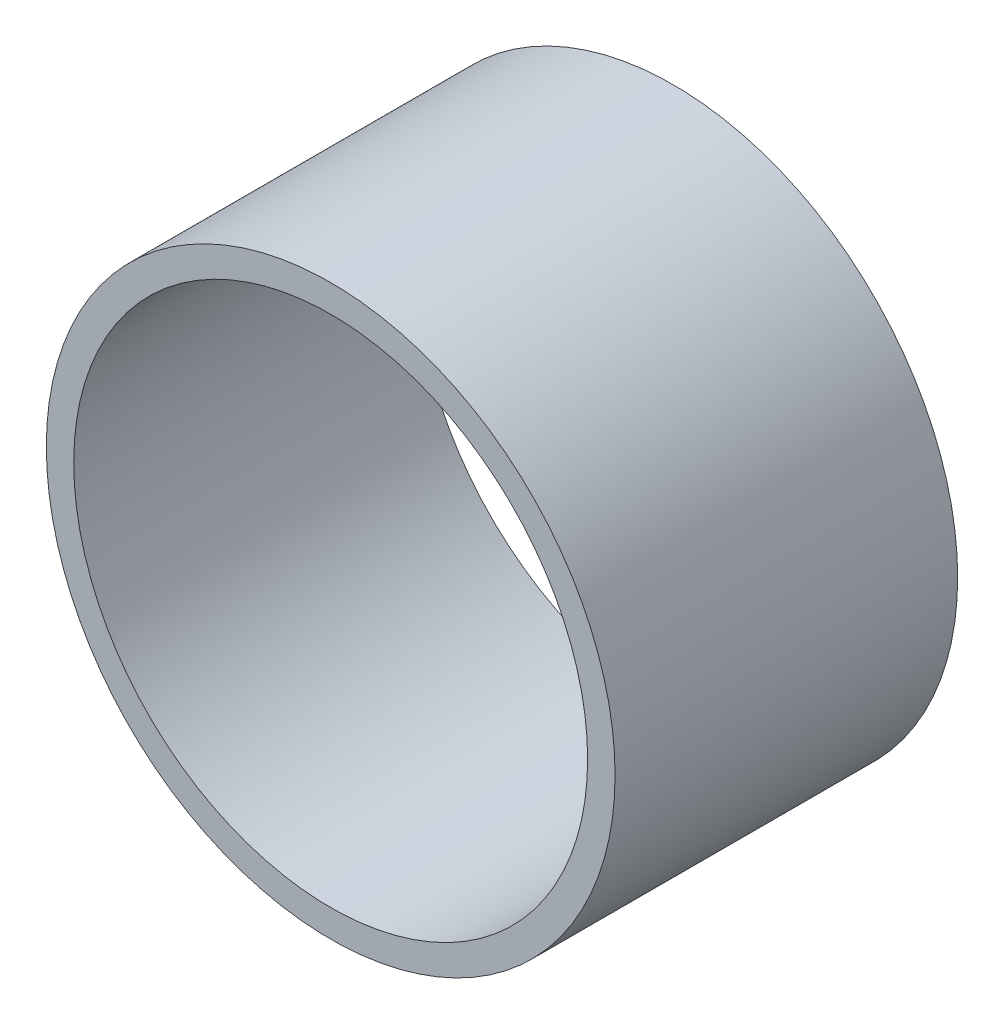
ISO-10303-21;
HEADER;
FILE_DESCRIPTION(('STEP AP214'),'2;1');
FILE_NAME('part.step','',(''),(''),'','','');
FILE_SCHEMA(('AUTOMOTIVE_DESIGN { 1 0 10303 214 1 1 1 1 }'));
ENDSEC;
DATA;
#1=APPLICATION_CONTEXT('core data for automotive mechanical design processes');
#2=APPLICATION_PROTOCOL_DEFINITION('international standard','automotive_design',2000,#1);
#3=PRODUCT_CONTEXT('',#1,'mechanical');
#4=PRODUCT('Part','Part','',(#3));
#5=PRODUCT_RELATED_PRODUCT_CATEGORY('part','',(#4));
#6=PRODUCT_DEFINITION_FORMATION('','',#4);
#7=PRODUCT_DEFINITION_CONTEXT('part definition',#1,'design');
#8=PRODUCT_DEFINITION('design','',#6,#7);
#9=PRODUCT_DEFINITION_SHAPE('','',#8);
#10=(LENGTH_UNIT() NAMED_UNIT(*) SI_UNIT(.MILLI.,.METRE.));
#11=(NAMED_UNIT(*) PLANE_ANGLE_UNIT() SI_UNIT($,.RADIAN.));
#12=(NAMED_UNIT(*) SI_UNIT($,.STERADIAN.) SOLID_ANGLE_UNIT());
#13=UNCERTAINTY_MEASURE_WITH_UNIT(LENGTH_MEASURE(1.E-05),#10,'distance_accuracy_value','');
#14=(GEOMETRIC_REPRESENTATION_CONTEXT(3) GLOBAL_UNCERTAINTY_ASSIGNED_CONTEXT((#13)) GLOBAL_UNIT_ASSIGNED_CONTEXT((#10,
#11,#12)) REPRESENTATION_CONTEXT('',''));
#15=CARTESIAN_POINT('',(0.,0.,0.));
#16=DIRECTION('',(0.,0.,1.));
#17=DIRECTION('',(1.,0.,0.));
#18=AXIS2_PLACEMENT_3D('',#15,#16,#17);
#19=CARTESIAN_POINT('',(0.,0.,0.5));
#20=DIRECTION('',(0.,0.,1.));
#21=DIRECTION('',(1.,0.,0.));
#22=AXIS2_PLACEMENT_3D('',#19,#20,#21);
#23=PLANE('',#22);
#24=CARTESIAN_POINT('',(0.,0.,0.5));
#25=DIRECTION('',(0.,0.,1.));
#26=DIRECTION('',(1.,0.,0.));
#27=AXIS2_PLACEMENT_3D('',#24,#25,#26);
#28=CIRCLE('',#27,0.415);
#29=CARTESIAN_POINT('',(0.415,0.,0.5));
#30=VERTEX_POINT('',#29);
#31=EDGE_CURVE('E10',#30,#30,#28,.T.);
#32=ORIENTED_EDGE('',*,*,#31,.T.);
#33=EDGE_LOOP('',(#32));
#34=FACE_BOUND('',#33,.T.);
#35=CARTESIAN_POINT('',(0.,0.,0.5));
#36=DIRECTION('',(0.,0.,1.));
#37=DIRECTION('',(1.,0.,0.));
#38=AXIS2_PLACEMENT_3D('',#35,#36,#37);
#39=CIRCLE('',#38,0.375);
#40=CARTESIAN_POINT('',(0.375,0.,0.5));
#41=VERTEX_POINT('',#40);
#42=EDGE_CURVE('E50',#41,#41,#39,.T.);
#43=ORIENTED_EDGE('',*,*,#42,.F.);
#44=EDGE_LOOP('',(#43));
#45=FACE_BOUND('',#44,.T.);
#46=ADVANCED_FACE('F37',(#34,#45),#23,.T.);
#47=CARTESIAN_POINT('',(0.,0.,0.));
#48=DIRECTION('',(0.,0.,1.));
#49=DIRECTION('',(1.,0.,0.));
#50=AXIS2_PLACEMENT_3D('',#47,#48,#49);
#51=PLANE('',#50);
#52=CARTESIAN_POINT('',(0.,0.,0.));
#53=DIRECTION('',(0.,0.,1.));
#54=DIRECTION('',(1.,0.,0.));
#55=AXIS2_PLACEMENT_3D('',#52,#53,#54);
#56=CIRCLE('',#55,0.415);
#57=CARTESIAN_POINT('',(0.415,0.,0.));
#58=VERTEX_POINT('',#57);
#59=EDGE_CURVE('E41',#58,#58,#56,.T.);
#60=ORIENTED_EDGE('',*,*,#59,.F.);
#61=EDGE_LOOP('',(#60));
#62=FACE_BOUND('',#61,.T.);
#63=CARTESIAN_POINT('',(0.,0.,0.));
#64=DIRECTION('',(0.,0.,1.));
#65=DIRECTION('',(1.,0.,0.));
#66=AXIS2_PLACEMENT_3D('',#63,#64,#65);
#67=CIRCLE('',#66,0.375);
#68=CARTESIAN_POINT('',(0.375,0.,0.));
#69=VERTEX_POINT('',#68);
#70=EDGE_CURVE('E52',#69,#69,#67,.T.);
#71=ORIENTED_EDGE('',*,*,#70,.T.);
#72=EDGE_LOOP('',(#71));
#73=FACE_BOUND('',#72,.T.);
#74=ADVANCED_FACE('F64',(#62,#73),#51,.F.);
#75=CARTESIAN_POINT('',(0.,0.,0.5));
#76=DIRECTION('',(0.,0.,-1.));
#77=DIRECTION('',(-1.,0.,0.));
#78=AXIS2_PLACEMENT_3D('',#75,#76,#77);
#79=CYLINDRICAL_SURFACE('',#78,0.415);
#80=ORIENTED_EDGE('',*,*,#31,.F.);
#81=EDGE_LOOP('',(#80));
#82=FACE_BOUND('',#81,.T.);
#83=ORIENTED_EDGE('',*,*,#59,.T.);
#84=EDGE_LOOP('',(#83));
#85=FACE_BOUND('',#84,.T.);
#86=ADVANCED_FACE('F39',(#82,#85),#79,.T.);
#87=CARTESIAN_POINT('',(0.,0.,0.5));
#88=DIRECTION('',(0.,0.,-1.));
#89=DIRECTION('',(-1.,0.,0.));
#90=AXIS2_PLACEMENT_3D('',#87,#88,#89);
#91=CYLINDRICAL_SURFACE('',#90,0.375);
#92=ORIENTED_EDGE('',*,*,#42,.T.);
#93=EDGE_LOOP('',(#92));
#94=FACE_BOUND('',#93,.T.);
#95=ORIENTED_EDGE('',*,*,#70,.F.);
#96=EDGE_LOOP('',(#95));
#97=FACE_BOUND('',#96,.T.);
#98=ADVANCED_FACE('F60',(#94,#97),#91,.F.);
#99=CLOSED_SHELL('',(#46,#74,#86,#98));
#100=MANIFOLD_SOLID_BREP('B2',#99);
#101=ADVANCED_BREP_SHAPE_REPRESENTATION('',(#18,#100),#14);
#102=SHAPE_DEFINITION_REPRESENTATION(#9,#101);
ENDSEC;
END-ISO-10303-21;
